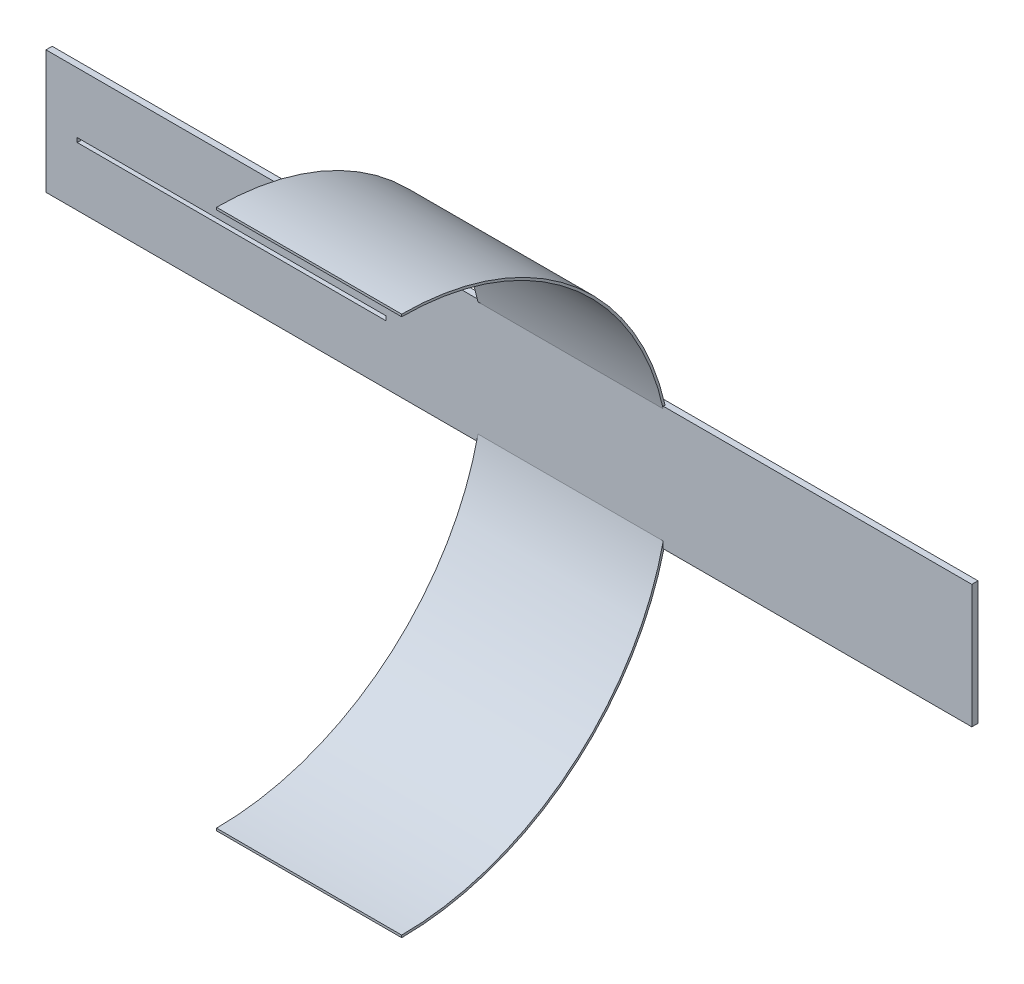
ISO-10303-21;
HEADER;
FILE_DESCRIPTION(('STEP AP214'),'2;1');
FILE_NAME('part.step','',(''),(''),'','','');
FILE_SCHEMA(('AUTOMOTIVE_DESIGN { 1 0 10303 214 1 1 1 1 }'));
ENDSEC;
DATA;
#1=APPLICATION_CONTEXT('core data for automotive mechanical design processes');
#2=APPLICATION_PROTOCOL_DEFINITION('international standard','automotive_design',2000,#1);
#3=PRODUCT_CONTEXT('',#1,'mechanical');
#4=PRODUCT('Part','Part','',(#3));
#5=PRODUCT_RELATED_PRODUCT_CATEGORY('part','',(#4));
#6=PRODUCT_DEFINITION_FORMATION('','',#4);
#7=PRODUCT_DEFINITION_CONTEXT('part definition',#1,'design');
#8=PRODUCT_DEFINITION('design','',#6,#7);
#9=PRODUCT_DEFINITION_SHAPE('','',#8);
#10=(LENGTH_UNIT() NAMED_UNIT(*) SI_UNIT(.MILLI.,.METRE.));
#11=(NAMED_UNIT(*) PLANE_ANGLE_UNIT() SI_UNIT($,.RADIAN.));
#12=(NAMED_UNIT(*) SI_UNIT($,.STERADIAN.) SOLID_ANGLE_UNIT());
#13=UNCERTAINTY_MEASURE_WITH_UNIT(LENGTH_MEASURE(1.E-05),#10,'distance_accuracy_value','');
#14=(GEOMETRIC_REPRESENTATION_CONTEXT(3) GLOBAL_UNCERTAINTY_ASSIGNED_CONTEXT((#13)) GLOBAL_UNIT_ASSIGNED_CONTEXT((#10,
#11,#12)) REPRESENTATION_CONTEXT('',''));
#15=CARTESIAN_POINT('',(0.,0.,0.));
#16=DIRECTION('',(0.,0.,1.));
#17=DIRECTION('',(1.,0.,0.));
#18=AXIS2_PLACEMENT_3D('',#15,#16,#17);
#19=CARTESIAN_POINT('',(0.,0.,1.));
#20=DIRECTION('',(0.,0.,1.));
#21=DIRECTION('',(1.,0.,0.));
#22=AXIS2_PLACEMENT_3D('',#19,#20,#21);
#23=PLANE('',#22);
#24=DIRECTION('',(-1.,0.,0.));
#25=VECTOR('',#24,1.);
#26=CARTESIAN_POINT('',(-24.9999999999998,0.349999999999996,1.));
#27=LINE('',#26,#25);
#28=CARTESIAN_POINT('',(25.0000000000002,0.349999999999996,1.));
#29=VERTEX_POINT('',#28);
#30=CARTESIAN_POINT('',(-24.9999999999998,0.349999999999996,1.));
#31=VERTEX_POINT('',#30);
#32=EDGE_CURVE('E281',#29,#31,#27,.T.);
#33=ORIENTED_EDGE('',*,*,#32,.F.);
#34=DIRECTION('',(0.,1.,0.));
#35=VECTOR('',#34,1.);
#36=CARTESIAN_POINT('',(25.0000000000003,-0.350000000000003,1.));
#37=LINE('',#36,#35);
#38=CARTESIAN_POINT('',(25.0000000000003,-0.350000000000003,1.));
#39=VERTEX_POINT('',#38);
#40=EDGE_CURVE('E279',#39,#29,#37,.T.);
#41=ORIENTED_EDGE('',*,*,#40,.F.);
#42=DIRECTION('',(1.,0.,0.));
#43=VECTOR('',#42,1.);
#44=CARTESIAN_POINT('',(-24.9999999999998,-0.350000000000003,1.));
#45=LINE('',#44,#43);
#46=CARTESIAN_POINT('',(-24.9999999999998,-0.350000000000003,1.));
#47=VERTEX_POINT('',#46);
#48=EDGE_CURVE('E287',#47,#39,#45,.T.);
#49=ORIENTED_EDGE('',*,*,#48,.F.);
#50=DIRECTION('',(0.,-1.,0.));
#51=VECTOR('',#50,1.);
#52=CARTESIAN_POINT('',(-24.9999999999998,-0.350000000000003,1.));
#53=LINE('',#52,#51);
#54=EDGE_CURVE('E284',#31,#47,#53,.T.);
#55=ORIENTED_EDGE('',*,*,#54,.F.);
#56=EDGE_LOOP('',(#33,#41,#49,#55));
#57=FACE_BOUND('',#56,.T.);
#58=DIRECTION('',(1.,0.,0.));
#59=VECTOR('',#58,1.);
#60=CARTESIAN_POINT('',(-30.0618398784162,-9.87151059229571,1.));
#61=LINE('',#60,#59);
#62=CARTESIAN_POINT('',(-30.0618398784162,-9.87151059229571,1.));
#63=VERTEX_POINT('',#62);
#64=CARTESIAN_POINT('',(39.9381601215838,-9.87151059229571,1.));
#65=VERTEX_POINT('',#64);
#66=EDGE_CURVE('E315',#63,#65,#61,.T.);
#67=ORIENTED_EDGE('',*,*,#66,.T.);
#68=DIRECTION('',(0.,1.,0.));
#69=VECTOR('',#68,1.);
#70=CARTESIAN_POINT('',(39.9381601215838,0.,1.));
#71=LINE('',#70,#69);
#72=CARTESIAN_POINT('',(39.9381601215838,-8.79210161231091,1.));
#73=VERTEX_POINT('',#72);
#74=EDGE_CURVE('E261',#65,#73,#71,.T.);
#75=ORIENTED_EDGE('',*,*,#74,.T.);
#76=DIRECTION('',(1.,0.,0.));
#77=VECTOR('',#76,1.);
#78=CARTESIAN_POINT('',(39.9381601215838,-8.79210161231091,1.));
#79=LINE('',#78,#77);
#80=CARTESIAN_POINT('',(69.9381601215837,-8.79210161231091,1.));
#81=VERTEX_POINT('',#80);
#82=EDGE_CURVE('E209',#73,#81,#79,.T.);
#83=ORIENTED_EDGE('',*,*,#82,.T.);
#84=DIRECTION('',(0.,1.,0.));
#85=VECTOR('',#84,1.);
#86=CARTESIAN_POINT('',(69.9381601215837,0.,1.));
#87=LINE('',#86,#85);
#88=CARTESIAN_POINT('',(69.9381601215837,-9.87151059229571,1.));
#89=VERTEX_POINT('',#88);
#90=EDGE_CURVE('E250',#89,#81,#87,.T.);
#91=ORIENTED_EDGE('',*,*,#90,.F.);
#92=CARTESIAN_POINT('',(119.938160121584,-9.87151059229571,1.));
#93=VERTEX_POINT('',#92);
#94=EDGE_CURVE('E313',#89,#93,#61,.T.);
#95=ORIENTED_EDGE('',*,*,#94,.T.);
#96=DIRECTION('',(0.,1.,0.));
#97=VECTOR('',#96,1.);
#98=CARTESIAN_POINT('',(119.938160121584,10.1284894077043,1.));
#99=LINE('',#98,#97);
#100=CARTESIAN_POINT('',(119.938160121584,10.1284894077043,1.));
#101=VERTEX_POINT('',#100);
#102=EDGE_CURVE('E318',#93,#101,#99,.T.);
#103=ORIENTED_EDGE('',*,*,#102,.T.);
#104=DIRECTION('',(-1.,0.,0.));
#105=VECTOR('',#104,1.);
#106=CARTESIAN_POINT('',(-30.0618398784162,10.1284894077043,1.));
#107=LINE('',#106,#105);
#108=CARTESIAN_POINT('',(69.9381601215837,10.1284894077043,1.));
#109=VERTEX_POINT('',#108);
#110=EDGE_CURVE('E321',#101,#109,#107,.T.);
#111=ORIENTED_EDGE('',*,*,#110,.T.);
#112=CARTESIAN_POINT('',(69.9381601215837,9.75288598633908,1.));
#113=VERTEX_POINT('',#112);
#114=EDGE_CURVE('E243',#113,#109,#87,.T.);
#115=ORIENTED_EDGE('',*,*,#114,.F.);
#116=DIRECTION('',(1.,0.,0.));
#117=VECTOR('',#116,1.);
#118=CARTESIAN_POINT('',(39.9381601215838,9.75288598633908,1.));
#119=LINE('',#118,#117);
#120=CARTESIAN_POINT('',(39.9381601215838,9.75288598633908,1.));
#121=VERTEX_POINT('',#120);
#122=EDGE_CURVE('E274',#113,#121,#119,.F.);
#123=ORIENTED_EDGE('',*,*,#122,.T.);
#124=CARTESIAN_POINT('',(39.9381601215838,10.1284894077043,1.));
#125=VERTEX_POINT('',#124);
#126=EDGE_CURVE('E257',#121,#125,#71,.T.);
#127=ORIENTED_EDGE('',*,*,#126,.T.);
#128=CARTESIAN_POINT('',(-30.0618398784162,10.1284894077043,1.));
#129=VERTEX_POINT('',#128);
#130=EDGE_CURVE('E320',#125,#129,#107,.T.);
#131=ORIENTED_EDGE('',*,*,#130,.T.);
#132=DIRECTION('',(0.,-1.,0.));
#133=VECTOR('',#132,1.);
#134=CARTESIAN_POINT('',(-30.0618398784162,10.1284894077043,1.));
#135=LINE('',#134,#133);
#136=EDGE_CURVE('E310',#129,#63,#135,.T.);
#137=ORIENTED_EDGE('',*,*,#136,.T.);
#138=EDGE_LOOP('',(#67,#75,#83,#91,#95,#103,#111,#115,#123,#127,#131,#137));
#139=FACE_BOUND('',#138,.T.);
#140=ADVANCED_FACE('F45',(#57,#139),#23,.T.);
#141=CARTESIAN_POINT('',(0.,0.,0.));
#142=DIRECTION('',(0.,0.,1.));
#143=DIRECTION('',(1.,0.,0.));
#144=AXIS2_PLACEMENT_3D('',#141,#142,#143);
#145=PLANE('',#144);
#146=DIRECTION('',(0.,1.,0.));
#147=VECTOR('',#146,1.);
#148=CARTESIAN_POINT('',(39.9381601215838,0.,0.));
#149=LINE('',#148,#147);
#150=CARTESIAN_POINT('',(39.9381601215838,0.960784374027763,0.));
#151=VERTEX_POINT('',#150);
#152=CARTESIAN_POINT('',(39.9381601215838,6.202525493906,0.));
#153=VERTEX_POINT('',#152);
#154=EDGE_CURVE('E263',#151,#153,#149,.T.);
#155=ORIENTED_EDGE('',*,*,#154,.F.);
#156=DIRECTION('',(1.,0.,0.));
#157=VECTOR('',#156,1.);
#158=CARTESIAN_POINT('',(39.9381601215838,0.960784374027763,0.));
#159=LINE('',#158,#157);
#160=CARTESIAN_POINT('',(69.9381601215837,0.960784374027763,0.));
#161=VERTEX_POINT('',#160);
#162=EDGE_CURVE('E53',#161,#151,#159,.F.);
#163=ORIENTED_EDGE('',*,*,#162,.F.);
#164=DIRECTION('',(0.,1.,0.));
#165=VECTOR('',#164,1.);
#166=CARTESIAN_POINT('',(69.9381601215837,0.,0.));
#167=LINE('',#166,#165);
#168=CARTESIAN_POINT('',(69.9381601215837,6.202525493906,0.));
#169=VERTEX_POINT('',#168);
#170=EDGE_CURVE('E253',#161,#169,#167,.T.);
#171=ORIENTED_EDGE('',*,*,#170,.T.);
#172=DIRECTION('',(1.,0.,0.));
#173=VECTOR('',#172,1.);
#174=CARTESIAN_POINT('',(39.9381601215838,6.202525493906,0.));
#175=LINE('',#174,#173);
#176=EDGE_CURVE('E268',#169,#153,#175,.F.);
#177=ORIENTED_EDGE('',*,*,#176,.T.);
#178=EDGE_LOOP('',(#155,#163,#171,#177));
#179=FACE_BOUND('',#178,.T.);
#180=DIRECTION('',(0.,-1.,0.));
#181=VECTOR('',#180,1.);
#182=CARTESIAN_POINT('',(-30.0618398784162,10.1284894077043,0.));
#183=LINE('',#182,#181);
#184=CARTESIAN_POINT('',(-30.0618398784162,10.1284894077043,0.));
#185=VERTEX_POINT('',#184);
#186=CARTESIAN_POINT('',(-30.0618398784162,-9.87151059229571,0.));
#187=VERTEX_POINT('',#186);
#188=EDGE_CURVE('E309',#185,#187,#183,.T.);
#189=ORIENTED_EDGE('',*,*,#188,.F.);
#190=DIRECTION('',(-1.,0.,0.));
#191=VECTOR('',#190,1.);
#192=CARTESIAN_POINT('',(-30.0618398784162,10.1284894077043,0.));
#193=LINE('',#192,#191);
#194=CARTESIAN_POINT('',(119.938160121584,10.1284894077043,0.));
#195=VERTEX_POINT('',#194);
#196=EDGE_CURVE('E314',#195,#185,#193,.T.);
#197=ORIENTED_EDGE('',*,*,#196,.F.);
#198=DIRECTION('',(0.,1.,0.));
#199=VECTOR('',#198,1.);
#200=CARTESIAN_POINT('',(119.938160121584,10.1284894077043,0.));
#201=LINE('',#200,#199);
#202=CARTESIAN_POINT('',(119.938160121584,-9.87151059229571,0.));
#203=VERTEX_POINT('',#202);
#204=EDGE_CURVE('E329',#203,#195,#201,.T.);
#205=ORIENTED_EDGE('',*,*,#204,.F.);
#206=DIRECTION('',(1.,0.,0.));
#207=VECTOR('',#206,1.);
#208=CARTESIAN_POINT('',(-30.0618398784162,-9.87151059229571,0.));
#209=LINE('',#208,#207);
#210=EDGE_CURVE('E327',#187,#203,#209,.T.);
#211=ORIENTED_EDGE('',*,*,#210,.F.);
#212=EDGE_LOOP('',(#189,#197,#205,#211));
#213=FACE_BOUND('',#212,.T.);
#214=DIRECTION('',(0.,1.,0.));
#215=VECTOR('',#214,1.);
#216=CARTESIAN_POINT('',(25.0000000000003,-0.350000000000003,0.));
#217=LINE('',#216,#215);
#218=CARTESIAN_POINT('',(25.0000000000003,-0.350000000000003,0.));
#219=VERTEX_POINT('',#218);
#220=CARTESIAN_POINT('',(25.0000000000002,0.349999999999996,0.));
#221=VERTEX_POINT('',#220);
#222=EDGE_CURVE('E278',#219,#221,#217,.T.);
#223=ORIENTED_EDGE('',*,*,#222,.T.);
#224=DIRECTION('',(-1.,0.,0.));
#225=VECTOR('',#224,1.);
#226=CARTESIAN_POINT('',(-24.9999999999998,0.349999999999996,0.));
#227=LINE('',#226,#225);
#228=CARTESIAN_POINT('',(-24.9999999999998,0.349999999999996,0.));
#229=VERTEX_POINT('',#228);
#230=EDGE_CURVE('E292',#221,#229,#227,.T.);
#231=ORIENTED_EDGE('',*,*,#230,.T.);
#232=DIRECTION('',(0.,-1.,0.));
#233=VECTOR('',#232,1.);
#234=CARTESIAN_POINT('',(-24.9999999999998,-0.350000000000003,0.));
#235=LINE('',#234,#233);
#236=CARTESIAN_POINT('',(-24.9999999999998,-0.350000000000003,0.));
#237=VERTEX_POINT('',#236);
#238=EDGE_CURVE('E295',#229,#237,#235,.T.);
#239=ORIENTED_EDGE('',*,*,#238,.T.);
#240=DIRECTION('',(1.,0.,0.));
#241=VECTOR('',#240,1.);
#242=CARTESIAN_POINT('',(-24.9999999999998,-0.350000000000003,0.));
#243=LINE('',#242,#241);
#244=EDGE_CURVE('E282',#237,#219,#243,.T.);
#245=ORIENTED_EDGE('',*,*,#244,.T.);
#246=EDGE_LOOP('',(#223,#231,#239,#245));
#247=FACE_BOUND('',#246,.T.);
#248=CARTESIAN_POINT('',(39.9381601215838,-5.24174111987783,0.));
#249=VERTEX_POINT('',#248);
#250=CARTESIAN_POINT('',(39.9381601215838,4.05220561966457E-13,0.));
#251=VERTEX_POINT('',#250);
#252=EDGE_CURVE('E265',#249,#251,#149,.T.);
#253=ORIENTED_EDGE('',*,*,#252,.F.);
#254=DIRECTION('',(1.,0.,0.));
#255=VECTOR('',#254,1.);
#256=CARTESIAN_POINT('',(39.9381601215838,-5.24174111987783,0.));
#257=LINE('',#256,#255);
#258=CARTESIAN_POINT('',(69.9381601215837,-5.24174111987783,0.));
#259=VERTEX_POINT('',#258);
#260=EDGE_CURVE('E271',#249,#259,#257,.T.);
#261=ORIENTED_EDGE('',*,*,#260,.T.);
#262=CARTESIAN_POINT('',(69.9381601215837,4.05220561966457E-13,0.));
#263=VERTEX_POINT('',#262);
#264=EDGE_CURVE('E256',#259,#263,#167,.T.);
#265=ORIENTED_EDGE('',*,*,#264,.T.);
#266=DIRECTION('',(1.,0.,0.));
#267=VECTOR('',#266,1.);
#268=CARTESIAN_POINT('',(39.9381601215838,4.05220561966457E-13,0.));
#269=LINE('',#268,#267);
#270=EDGE_CURVE('E11',#251,#263,#269,.T.);
#271=ORIENTED_EDGE('',*,*,#270,.F.);
#272=EDGE_LOOP('',(#253,#261,#265,#271));
#273=FACE_BOUND('',#272,.T.);
#274=ADVANCED_FACE('F362',(#179,#213,#247,#273),#145,.F.);
#275=CARTESIAN_POINT('',(-30.0618398784162,-9.87151059229571,1.));
#276=DIRECTION('',(0.,1.,0.));
#277=DIRECTION('',(0.,0.,1.));
#278=AXIS2_PLACEMENT_3D('',#275,#276,#277);
#279=PLANE('',#278);
#280=DIRECTION('',(0.,0.,-1.));
#281=VECTOR('',#280,1.);
#282=CARTESIAN_POINT('',(39.9381601215838,-9.87151059229571,1.));
#283=LINE('',#282,#281);
#284=CARTESIAN_POINT('',(39.9381601215838,-9.87151059229571,0.866528769986386));
#285=VERTEX_POINT('',#284);
#286=EDGE_CURVE('E260',#65,#285,#283,.T.);
#287=ORIENTED_EDGE('',*,*,#286,.F.);
#288=ORIENTED_EDGE('',*,*,#66,.F.);
#289=DIRECTION('',(0.,0.,-1.));
#290=VECTOR('',#289,1.);
#291=CARTESIAN_POINT('',(-30.0618398784162,-9.87151059229571,1.));
#292=LINE('',#291,#290);
#293=EDGE_CURVE('E340',#63,#187,#292,.T.);
#294=ORIENTED_EDGE('',*,*,#293,.T.);
#295=ORIENTED_EDGE('',*,*,#210,.T.);
#296=DIRECTION('',(0.,0.,-1.));
#297=VECTOR('',#296,1.);
#298=CARTESIAN_POINT('',(119.938160121584,-9.87151059229571,1.));
#299=LINE('',#298,#297);
#300=EDGE_CURVE('E337',#93,#203,#299,.T.);
#301=ORIENTED_EDGE('',*,*,#300,.F.);
#302=ORIENTED_EDGE('',*,*,#94,.F.);
#303=DIRECTION('',(0.,0.,-1.));
#304=VECTOR('',#303,1.);
#305=CARTESIAN_POINT('',(69.9381601215837,-9.87151059229571,1.));
#306=LINE('',#305,#304);
#307=CARTESIAN_POINT('',(69.9381601215837,-9.87151059229571,0.866528769986386));
#308=VERTEX_POINT('',#307);
#309=EDGE_CURVE('E249',#89,#308,#306,.T.);
#310=ORIENTED_EDGE('',*,*,#309,.T.);
#311=DIRECTION('',(1.,0.,0.));
#312=VECTOR('',#311,1.);
#313=CARTESIAN_POINT('',(39.9381601215838,-9.87151059229571,0.866528769986386));
#314=LINE('',#313,#312);
#315=EDGE_CURVE('E266',#308,#285,#314,.F.);
#316=ORIENTED_EDGE('',*,*,#315,.T.);
#317=EDGE_LOOP('',(#287,#288,#294,#295,#301,#302,#310,#316));
#318=FACE_BOUND('',#317,.T.);
#319=ADVANCED_FACE('F391',(#318),#279,.F.);
#320=CARTESIAN_POINT('',(-30.0618398784162,10.1284894077043,1.));
#321=DIRECTION('',(0.,-1.,0.));
#322=DIRECTION('',(0.,0.,-1.));
#323=AXIS2_PLACEMENT_3D('',#320,#321,#322);
#324=PLANE('',#323);
#325=DIRECTION('',(0.,0.,1.));
#326=VECTOR('',#325,1.);
#327=CARTESIAN_POINT('',(39.9381601215838,10.1284894077043,1.));
#328=LINE('',#327,#326);
#329=CARTESIAN_POINT('',(39.9381601215838,10.1284894077043,0.701278487402299));
#330=VERTEX_POINT('',#329);
#331=EDGE_CURVE('E349',#330,#125,#328,.T.);
#332=ORIENTED_EDGE('',*,*,#331,.F.);
#333=DIRECTION('',(1.,0.,0.));
#334=VECTOR('',#333,1.);
#335=CARTESIAN_POINT('',(39.9381601215838,10.1284894077043,0.701278487402299));
#336=LINE('',#335,#334);
#337=CARTESIAN_POINT('',(69.9381601215837,10.1284894077043,0.701278487402299));
#338=VERTEX_POINT('',#337);
#339=EDGE_CURVE('E346',#330,#338,#336,.T.);
#340=ORIENTED_EDGE('',*,*,#339,.T.);
#341=DIRECTION('',(0.,0.,1.));
#342=VECTOR('',#341,1.);
#343=CARTESIAN_POINT('',(69.9381601215837,10.1284894077043,1.));
#344=LINE('',#343,#342);
#345=EDGE_CURVE('E343',#338,#109,#344,.T.);
#346=ORIENTED_EDGE('',*,*,#345,.T.);
#347=ORIENTED_EDGE('',*,*,#110,.F.);
#348=DIRECTION('',(0.,0.,-1.));
#349=VECTOR('',#348,1.);
#350=CARTESIAN_POINT('',(119.938160121584,10.1284894077043,1.));
#351=LINE('',#350,#349);
#352=EDGE_CURVE('E334',#101,#195,#351,.T.);
#353=ORIENTED_EDGE('',*,*,#352,.T.);
#354=ORIENTED_EDGE('',*,*,#196,.T.);
#355=DIRECTION('',(0.,0.,-1.));
#356=VECTOR('',#355,1.);
#357=CARTESIAN_POINT('',(-30.0618398784162,10.1284894077043,1.));
#358=LINE('',#357,#356);
#359=EDGE_CURVE('E324',#129,#185,#358,.T.);
#360=ORIENTED_EDGE('',*,*,#359,.F.);
#361=ORIENTED_EDGE('',*,*,#130,.F.);
#362=EDGE_LOOP('',(#332,#340,#346,#347,#353,#354,#360,#361));
#363=FACE_BOUND('',#362,.T.);
#364=ADVANCED_FACE('F399',(#363),#324,.F.);
#365=CARTESIAN_POINT('',(-30.0618398784162,10.1284894077043,1.));
#366=DIRECTION('',(1.,0.,0.));
#367=DIRECTION('',(0.,0.,-1.));
#368=AXIS2_PLACEMENT_3D('',#365,#366,#367);
#369=PLANE('',#368);
#370=ORIENTED_EDGE('',*,*,#188,.T.);
#371=ORIENTED_EDGE('',*,*,#293,.F.);
#372=ORIENTED_EDGE('',*,*,#136,.F.);
#373=ORIENTED_EDGE('',*,*,#359,.T.);
#374=EDGE_LOOP('',(#370,#371,#372,#373));
#375=FACE_BOUND('',#374,.T.);
#376=ADVANCED_FACE('F47',(#375),#369,.F.);
#377=CARTESIAN_POINT('',(119.938160121584,10.1284894077043,1.));
#378=DIRECTION('',(-1.,0.,0.));
#379=DIRECTION('',(0.,0.,1.));
#380=AXIS2_PLACEMENT_3D('',#377,#378,#379);
#381=PLANE('',#380);
#382=ORIENTED_EDGE('',*,*,#204,.T.);
#383=ORIENTED_EDGE('',*,*,#352,.F.);
#384=ORIENTED_EDGE('',*,*,#102,.F.);
#385=ORIENTED_EDGE('',*,*,#300,.T.);
#386=EDGE_LOOP('',(#382,#383,#384,#385));
#387=FACE_BOUND('',#386,.T.);
#388=ADVANCED_FACE('F403',(#387),#381,.F.);
#389=CARTESIAN_POINT('',(25.0000000000003,-0.350000000000003,1.));
#390=DIRECTION('',(-1.,0.,0.));
#391=DIRECTION('',(0.,-1.,0.));
#392=AXIS2_PLACEMENT_3D('',#389,#390,#391);
#393=PLANE('',#392);
#394=ORIENTED_EDGE('',*,*,#222,.F.);
#395=DIRECTION('',(0.,0.,-1.));
#396=VECTOR('',#395,1.);
#397=CARTESIAN_POINT('',(25.0000000000003,-0.350000000000003,1.));
#398=LINE('',#397,#396);
#399=EDGE_CURVE('E289',#39,#219,#398,.T.);
#400=ORIENTED_EDGE('',*,*,#399,.F.);
#401=ORIENTED_EDGE('',*,*,#40,.T.);
#402=DIRECTION('',(0.,0.,-1.));
#403=VECTOR('',#402,1.);
#404=CARTESIAN_POINT('',(25.0000000000002,0.349999999999996,1.));
#405=LINE('',#404,#403);
#406=EDGE_CURVE('E306',#29,#221,#405,.T.);
#407=ORIENTED_EDGE('',*,*,#406,.T.);
#408=EDGE_LOOP('',(#394,#400,#401,#407));
#409=FACE_BOUND('',#408,.T.);
#410=ADVANCED_FACE('F396',(#409),#393,.T.);
#411=CARTESIAN_POINT('',(-24.9999999999998,0.349999999999996,1.));
#412=DIRECTION('',(0.,-1.,0.));
#413=DIRECTION('',(0.,0.,-1.));
#414=AXIS2_PLACEMENT_3D('',#411,#412,#413);
#415=PLANE('',#414);
#416=ORIENTED_EDGE('',*,*,#230,.F.);
#417=ORIENTED_EDGE('',*,*,#406,.F.);
#418=ORIENTED_EDGE('',*,*,#32,.T.);
#419=DIRECTION('',(0.,0.,-1.));
#420=VECTOR('',#419,1.);
#421=CARTESIAN_POINT('',(-24.9999999999998,0.349999999999996,1.));
#422=LINE('',#421,#420);
#423=EDGE_CURVE('E304',#31,#229,#422,.T.);
#424=ORIENTED_EDGE('',*,*,#423,.T.);
#425=EDGE_LOOP('',(#416,#417,#418,#424));
#426=FACE_BOUND('',#425,.T.);
#427=ADVANCED_FACE('F470',(#426),#415,.T.);
#428=CARTESIAN_POINT('',(-24.9999999999998,-0.350000000000003,1.));
#429=DIRECTION('',(1.,0.,0.));
#430=DIRECTION('',(0.,0.,-1.));
#431=AXIS2_PLACEMENT_3D('',#428,#429,#430);
#432=PLANE('',#431);
#433=ORIENTED_EDGE('',*,*,#238,.F.);
#434=ORIENTED_EDGE('',*,*,#423,.F.);
#435=ORIENTED_EDGE('',*,*,#54,.T.);
#436=DIRECTION('',(0.,0.,-1.));
#437=VECTOR('',#436,1.);
#438=CARTESIAN_POINT('',(-24.9999999999998,-0.350000000000003,1.));
#439=LINE('',#438,#437);
#440=EDGE_CURVE('E302',#47,#237,#439,.T.);
#441=ORIENTED_EDGE('',*,*,#440,.T.);
#442=EDGE_LOOP('',(#433,#434,#435,#441));
#443=FACE_BOUND('',#442,.T.);
#444=ADVANCED_FACE('F465',(#443),#432,.T.);
#445=CARTESIAN_POINT('',(-24.9999999999998,-0.350000000000003,1.));
#446=DIRECTION('',(0.,1.,0.));
#447=DIRECTION('',(0.,0.,1.));
#448=AXIS2_PLACEMENT_3D('',#445,#446,#447);
#449=PLANE('',#448);
#450=ORIENTED_EDGE('',*,*,#244,.F.);
#451=ORIENTED_EDGE('',*,*,#440,.F.);
#452=ORIENTED_EDGE('',*,*,#48,.T.);
#453=ORIENTED_EDGE('',*,*,#399,.T.);
#454=EDGE_LOOP('',(#450,#451,#452,#453));
#455=FACE_BOUND('',#454,.T.);
#456=ADVANCED_FACE('F462',(#455),#449,.T.);
#457=CARTESIAN_POINT('',(39.9381601215838,0.,43.3741823025882));
#458=DIRECTION('',(0.,0.,1.));
#459=DIRECTION('',(1.,0.,0.));
#460=AXIS2_PLACEMENT_3D('',#457,#458,#459);
#461=PLANE('',#460);
#462=DIRECTION('',(0.,-1.,0.));
#463=VECTOR('',#462,1.);
#464=CARTESIAN_POINT('',(69.9381601215837,0.,43.3741823025882));
#465=LINE('',#464,#463);
#466=CARTESIAN_POINT('',(69.9381601215837,44.2303921870141,43.3741823025882));
#467=VERTEX_POINT('',#466);
#468=CARTESIAN_POINT('',(69.9381601215837,43.857234707782,43.3741823025882));
#469=VERTEX_POINT('',#468);
#470=EDGE_CURVE('E238',#467,#469,#465,.T.);
#471=ORIENTED_EDGE('',*,*,#470,.F.);
#472=DIRECTION('',(1.,0.,0.));
#473=VECTOR('',#472,1.);
#474=CARTESIAN_POINT('',(39.9381601215838,44.2303921870141,43.3741823025882));
#475=LINE('',#474,#473);
#476=CARTESIAN_POINT('',(39.9381601215838,44.2303921870141,43.3741823025882));
#477=VERTEX_POINT('',#476);
#478=EDGE_CURVE('E244',#477,#467,#475,.T.);
#479=ORIENTED_EDGE('',*,*,#478,.F.);
#480=DIRECTION('',(0.,-1.,0.));
#481=VECTOR('',#480,1.);
#482=CARTESIAN_POINT('',(39.9381601215838,0.,43.3741823025882));
#483=LINE('',#482,#481);
#484=CARTESIAN_POINT('',(39.9381601215838,43.857234707782,43.3741823025882));
#485=VERTEX_POINT('',#484);
#486=EDGE_CURVE('E203',#477,#485,#483,.T.);
#487=ORIENTED_EDGE('',*,*,#486,.T.);
#488=DIRECTION('',(1.,0.,0.));
#489=VECTOR('',#488,1.);
#490=CARTESIAN_POINT('',(39.9381601215838,43.857234707782,43.3741823025882));
#491=LINE('',#490,#489);
#492=EDGE_CURVE('E241',#485,#469,#491,.T.);
#493=ORIENTED_EDGE('',*,*,#492,.T.);
#494=EDGE_LOOP('',(#471,#479,#487,#493));
#495=FACE_BOUND('',#494,.T.);
#496=ADVANCED_FACE('F382',(#495),#461,.T.);
#497=CARTESIAN_POINT('',(69.9381601215837,0.,0.));
#498=DIRECTION('',(1.,0.,0.));
#499=DIRECTION('',(0.,0.,-1.));
#500=AXIS2_PLACEMENT_3D('',#497,#498,#499);
#501=PLANE('',#500);
#502=CARTESIAN_POINT('',(69.9381601215837,0.480392187014084,43.3741823025882));
#503=DIRECTION('',(1.,0.,0.));
#504=DIRECTION('',(0.,0.,-1.));
#505=AXIS2_PLACEMENT_3D('',#502,#503,#504);
#506=CIRCLE('',#505,43.3768425207679);
#507=EDGE_CURVE('E235',#113,#469,#506,.T.);
#508=ORIENTED_EDGE('',*,*,#507,.F.);
#509=ORIENTED_EDGE('',*,*,#114,.T.);
#510=ORIENTED_EDGE('',*,*,#345,.F.);
#511=CARTESIAN_POINT('',(69.9381601215837,0.480392187014084,43.3741823025882));
#512=DIRECTION('',(1.,0.,0.));
#513=DIRECTION('',(0.,0.,-1.));
#514=AXIS2_PLACEMENT_3D('',#511,#512,#513);
#515=CIRCLE('',#514,43.75);
#516=EDGE_CURVE('E237',#338,#467,#515,.T.);
#517=ORIENTED_EDGE('',*,*,#516,.T.);
#518=ORIENTED_EDGE('',*,*,#470,.T.);
#519=EDGE_LOOP('',(#508,#509,#510,#517,#518));
#520=FACE_BOUND('',#519,.T.);
#521=ADVANCED_FACE('F372',(#520),#501,.T.);
#522=CARTESIAN_POINT('',(39.9381601215838,0.,0.));
#523=DIRECTION('',(1.,0.,0.));
#524=DIRECTION('',(0.,0.,-1.));
#525=AXIS2_PLACEMENT_3D('',#522,#523,#524);
#526=PLANE('',#525);
#527=ORIENTED_EDGE('',*,*,#126,.F.);
#528=CARTESIAN_POINT('',(39.9381601215838,0.480392187014084,43.3741823025882));
#529=DIRECTION('',(1.,0.,0.));
#530=DIRECTION('',(0.,0.,-1.));
#531=AXIS2_PLACEMENT_3D('',#528,#529,#530);
#532=CIRCLE('',#531,43.3768425207679);
#533=EDGE_CURVE('E214',#121,#485,#532,.T.);
#534=ORIENTED_EDGE('',*,*,#533,.T.);
#535=ORIENTED_EDGE('',*,*,#486,.F.);
#536=CARTESIAN_POINT('',(39.9381601215838,0.480392187014084,43.3741823025882));
#537=DIRECTION('',(1.,0.,0.));
#538=DIRECTION('',(0.,0.,-1.));
#539=AXIS2_PLACEMENT_3D('',#536,#537,#538);
#540=CIRCLE('',#539,43.75);
#541=EDGE_CURVE('E219',#330,#477,#540,.T.);
#542=ORIENTED_EDGE('',*,*,#541,.F.);
#543=ORIENTED_EDGE('',*,*,#331,.T.);
#544=EDGE_LOOP('',(#527,#534,#535,#542,#543));
#545=FACE_BOUND('',#544,.T.);
#546=ADVANCED_FACE('F377',(#545),#526,.F.);
#547=CARTESIAN_POINT('',(39.9381601215838,0.480392187014084,43.3741823025882));
#548=DIRECTION('',(1.,0.,0.));
#549=DIRECTION('',(0.,0.,-1.));
#550=AXIS2_PLACEMENT_3D('',#547,#548,#549);
#551=CYLINDRICAL_SURFACE('',#550,43.75);
#552=ORIENTED_EDGE('',*,*,#339,.F.);
#553=ORIENTED_EDGE('',*,*,#541,.T.);
#554=ORIENTED_EDGE('',*,*,#478,.T.);
#555=ORIENTED_EDGE('',*,*,#516,.F.);
#556=EDGE_LOOP('',(#552,#553,#554,#555));
#557=FACE_BOUND('',#556,.T.);
#558=ADVANCED_FACE('F432',(#557),#551,.T.);
#559=CARTESIAN_POINT('',(39.9381601215838,0.480392187014084,43.3741823025882));
#560=DIRECTION('',(1.,0.,0.));
#561=DIRECTION('',(0.,0.,-1.));
#562=AXIS2_PLACEMENT_3D('',#559,#560,#561);
#563=CYLINDRICAL_SURFACE('',#562,43.3768425207679);
#564=ORIENTED_EDGE('',*,*,#122,.F.);
#565=ORIENTED_EDGE('',*,*,#507,.T.);
#566=ORIENTED_EDGE('',*,*,#492,.F.);
#567=ORIENTED_EDGE('',*,*,#533,.F.);
#568=EDGE_LOOP('',(#564,#565,#566,#567));
#569=FACE_BOUND('',#568,.T.);
#570=ADVANCED_FACE('F438',(#569),#563,.F.);
#571=CARTESIAN_POINT('',(69.9381601215837,-42.8964503337539,43.3741823025882));
#572=VERTEX_POINT('',#571);
#573=CARTESIAN_POINT('',(69.9381601215837,-43.2696078129859,43.3741823025882));
#574=VERTEX_POINT('',#573);
#575=EDGE_CURVE('E198',#572,#574,#465,.T.);
#576=ORIENTED_EDGE('',*,*,#575,.F.);
#577=DIRECTION('',(1.,0.,0.));
#578=VECTOR('',#577,1.);
#579=CARTESIAN_POINT('',(39.9381601215838,-42.8964503337539,43.3741823025882));
#580=LINE('',#579,#578);
#581=CARTESIAN_POINT('',(39.9381601215838,-42.8964503337539,43.3741823025882));
#582=VERTEX_POINT('',#581);
#583=EDGE_CURVE('E192',#582,#572,#580,.T.);
#584=ORIENTED_EDGE('',*,*,#583,.F.);
#585=CARTESIAN_POINT('',(39.9381601215838,-43.2696078129859,43.3741823025882));
#586=VERTEX_POINT('',#585);
#587=EDGE_CURVE('E196',#582,#586,#483,.T.);
#588=ORIENTED_EDGE('',*,*,#587,.T.);
#589=DIRECTION('',(1.,0.,0.));
#590=VECTOR('',#589,1.);
#591=CARTESIAN_POINT('',(39.9381601215838,-43.2696078129859,43.3741823025882));
#592=LINE('',#591,#590);
#593=EDGE_CURVE('E202',#586,#574,#592,.T.);
#594=ORIENTED_EDGE('',*,*,#593,.T.);
#595=EDGE_LOOP('',(#576,#584,#588,#594));
#596=FACE_BOUND('',#595,.T.);
#597=ADVANCED_FACE('F194',(#596),#461,.T.);
#598=ORIENTED_EDGE('',*,*,#309,.F.);
#599=ORIENTED_EDGE('',*,*,#90,.T.);
#600=EDGE_CURVE('E233',#572,#81,#506,.T.);
#601=ORIENTED_EDGE('',*,*,#600,.F.);
#602=ORIENTED_EDGE('',*,*,#575,.T.);
#603=EDGE_CURVE('E239',#574,#308,#515,.T.);
#604=ORIENTED_EDGE('',*,*,#603,.T.);
#605=EDGE_LOOP('',(#598,#599,#601,#602,#604));
#606=FACE_BOUND('',#605,.T.);
#607=ADVANCED_FACE('F371',(#606),#501,.T.);
#608=ORIENTED_EDGE('',*,*,#74,.F.);
#609=ORIENTED_EDGE('',*,*,#286,.T.);
#610=EDGE_CURVE('E218',#586,#285,#540,.T.);
#611=ORIENTED_EDGE('',*,*,#610,.F.);
#612=ORIENTED_EDGE('',*,*,#587,.F.);
#613=EDGE_CURVE('E206',#582,#73,#532,.T.);
#614=ORIENTED_EDGE('',*,*,#613,.T.);
#615=EDGE_LOOP('',(#608,#609,#611,#612,#614));
#616=FACE_BOUND('',#615,.T.);
#617=ADVANCED_FACE('F216',(#616),#526,.F.);
#618=ORIENTED_EDGE('',*,*,#315,.F.);
#619=ORIENTED_EDGE('',*,*,#603,.F.);
#620=ORIENTED_EDGE('',*,*,#593,.F.);
#621=ORIENTED_EDGE('',*,*,#610,.T.);
#622=EDGE_LOOP('',(#618,#619,#620,#621));
#623=FACE_BOUND('',#622,.T.);
#624=ADVANCED_FACE('F429',(#623),#551,.T.);
#625=ORIENTED_EDGE('',*,*,#82,.F.);
#626=ORIENTED_EDGE('',*,*,#613,.F.);
#627=ORIENTED_EDGE('',*,*,#583,.T.);
#628=ORIENTED_EDGE('',*,*,#600,.T.);
#629=EDGE_LOOP('',(#625,#626,#627,#628));
#630=FACE_BOUND('',#629,.T.);
#631=ADVANCED_FACE('F207',(#630),#563,.F.);
#632=EDGE_CURVE('E212',#251,#151,#532,.T.);
#633=ORIENTED_EDGE('',*,*,#632,.F.);
#634=ORIENTED_EDGE('',*,*,#270,.T.);
#635=EDGE_CURVE('E60',#263,#161,#506,.T.);
#636=ORIENTED_EDGE('',*,*,#635,.T.);
#637=ORIENTED_EDGE('',*,*,#162,.T.);
#638=EDGE_LOOP('',(#633,#634,#636,#637));
#639=FACE_BOUND('',#638,.T.);
#640=ADVANCED_FACE('F354',(#639),#563,.F.);
#641=ORIENTED_EDGE('',*,*,#260,.F.);
#642=EDGE_CURVE('E221',#249,#153,#540,.T.);
#643=ORIENTED_EDGE('',*,*,#642,.T.);
#644=ORIENTED_EDGE('',*,*,#176,.F.);
#645=EDGE_CURVE('E64',#259,#169,#515,.T.);
#646=ORIENTED_EDGE('',*,*,#645,.F.);
#647=EDGE_LOOP('',(#641,#643,#644,#646));
#648=FACE_BOUND('',#647,.T.);
#649=ADVANCED_FACE('F365',(#648),#551,.T.);
#650=ORIENTED_EDGE('',*,*,#642,.F.);
#651=ORIENTED_EDGE('',*,*,#252,.T.);
#652=ORIENTED_EDGE('',*,*,#632,.T.);
#653=ORIENTED_EDGE('',*,*,#154,.T.);
#654=EDGE_LOOP('',(#650,#651,#652,#653));
#655=FACE_BOUND('',#654,.T.);
#656=ADVANCED_FACE('F360',(#655),#526,.F.);
#657=ORIENTED_EDGE('',*,*,#264,.F.);
#658=ORIENTED_EDGE('',*,*,#645,.T.);
#659=ORIENTED_EDGE('',*,*,#170,.F.);
#660=ORIENTED_EDGE('',*,*,#635,.F.);
#661=EDGE_LOOP('',(#657,#658,#659,#660));
#662=FACE_BOUND('',#661,.T.);
#663=ADVANCED_FACE('F368',(#662),#501,.T.);
#664=CLOSED_SHELL('',(#140,#274,#319,#364,#376,#388,#410,#427,#444,#456,#496,#521,#546,#558,
#570,#597,#607,#617,#624,#631,#640,#649,#656,#663));
#665=MANIFOLD_SOLID_BREP('B2',#664);
#666=ADVANCED_BREP_SHAPE_REPRESENTATION('',(#18,#665),#14);
#667=SHAPE_DEFINITION_REPRESENTATION(#9,#666);
ENDSEC;
END-ISO-10303-21;
